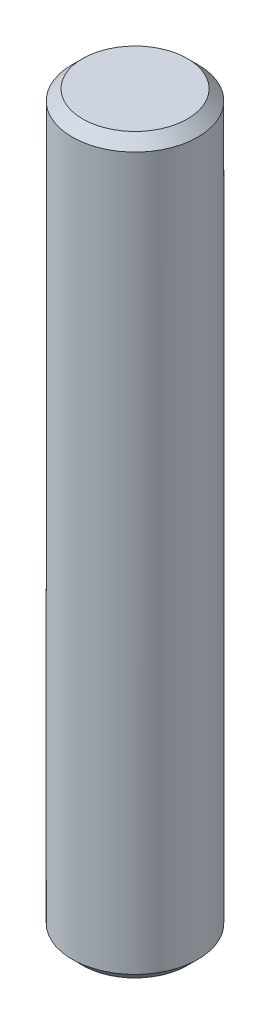
ISO-10303-21;
HEADER;
FILE_DESCRIPTION(('STEP AP214'),'2;1');
FILE_NAME('part.step','',(''),(''),'','','');
FILE_SCHEMA(('AUTOMOTIVE_DESIGN { 1 0 10303 214 1 1 1 1 }'));
ENDSEC;
DATA;
#1=APPLICATION_CONTEXT('core data for automotive mechanical design processes');
#2=APPLICATION_PROTOCOL_DEFINITION('international standard','automotive_design',2000,#1);
#3=PRODUCT_CONTEXT('',#1,'mechanical');
#4=PRODUCT('Part','Part','',(#3));
#5=PRODUCT_RELATED_PRODUCT_CATEGORY('part','',(#4));
#6=PRODUCT_DEFINITION_FORMATION('','',#4);
#7=PRODUCT_DEFINITION_CONTEXT('part definition',#1,'design');
#8=PRODUCT_DEFINITION('design','',#6,#7);
#9=PRODUCT_DEFINITION_SHAPE('','',#8);
#10=(LENGTH_UNIT() NAMED_UNIT(*) SI_UNIT(.MILLI.,.METRE.));
#11=(NAMED_UNIT(*) PLANE_ANGLE_UNIT() SI_UNIT($,.RADIAN.));
#12=(NAMED_UNIT(*) SI_UNIT($,.STERADIAN.) SOLID_ANGLE_UNIT());
#13=UNCERTAINTY_MEASURE_WITH_UNIT(LENGTH_MEASURE(1.E-05),#10,'distance_accuracy_value','');
#14=(GEOMETRIC_REPRESENTATION_CONTEXT(3) GLOBAL_UNCERTAINTY_ASSIGNED_CONTEXT((#13)) GLOBAL_UNIT_ASSIGNED_CONTEXT((#10,
#11,#12)) REPRESENTATION_CONTEXT('',''));
#15=CARTESIAN_POINT('',(0.,0.,0.));
#16=DIRECTION('',(0.,0.,1.));
#17=DIRECTION('',(1.,0.,0.));
#18=AXIS2_PLACEMENT_3D('',#15,#16,#17);
#19=CARTESIAN_POINT('',(0.,70.,0.));
#20=DIRECTION('',(0.,1.,0.));
#21=DIRECTION('',(0.,0.,1.));
#22=AXIS2_PLACEMENT_3D('',#19,#20,#21);
#23=PLANE('',#22);
#24=CARTESIAN_POINT('',(0.,70.,0.));
#25=DIRECTION('',(0.,1.,0.));
#26=DIRECTION('',(0.,0.,1.));
#27=AXIS2_PLACEMENT_3D('',#24,#25,#26);
#28=CIRCLE('',#27,4.99999999999999);
#29=CARTESIAN_POINT('',(0.,70.,4.99999999999999));
#30=VERTEX_POINT('',#29);
#31=EDGE_CURVE('E10',#30,#30,#28,.T.);
#32=ORIENTED_EDGE('',*,*,#31,.T.);
#33=EDGE_LOOP('',(#32));
#34=FACE_BOUND('',#33,.T.);
#35=ADVANCED_FACE('F39',(#34),#23,.T.);
#36=CARTESIAN_POINT('',(0.,0.,0.));
#37=DIRECTION('',(0.,-1.,0.));
#38=DIRECTION('',(0.,0.,-1.));
#39=AXIS2_PLACEMENT_3D('',#36,#37,#38);
#40=CYLINDRICAL_SURFACE('',#39,6.);
#41=CARTESIAN_POINT('',(0.,1.00000000000001,0.));
#42=DIRECTION('',(0.,-1.,0.));
#43=DIRECTION('',(0.,0.,-1.));
#44=AXIS2_PLACEMENT_3D('',#41,#42,#43);
#45=CIRCLE('',#44,6.);
#46=CARTESIAN_POINT('',(0.,1.00000000000001,-6.));
#47=VERTEX_POINT('',#46);
#48=EDGE_CURVE('E47',#47,#47,#45,.F.);
#49=ORIENTED_EDGE('',*,*,#48,.T.);
#50=EDGE_LOOP('',(#49));
#51=FACE_BOUND('',#50,.T.);
#52=CARTESIAN_POINT('',(0.,69.,0.));
#53=DIRECTION('',(0.,1.,0.));
#54=DIRECTION('',(0.,0.,1.));
#55=AXIS2_PLACEMENT_3D('',#52,#53,#54);
#56=CIRCLE('',#55,6.);
#57=CARTESIAN_POINT('',(0.,69.,6.));
#58=VERTEX_POINT('',#57);
#59=EDGE_CURVE('E51',#58,#58,#56,.F.);
#60=ORIENTED_EDGE('',*,*,#59,.T.);
#61=EDGE_LOOP('',(#60));
#62=FACE_BOUND('',#61,.T.);
#63=ADVANCED_FACE('F71',(#51,#62),#40,.T.);
#64=CARTESIAN_POINT('',(0.,0.,0.));
#65=DIRECTION('',(0.,-1.,0.));
#66=DIRECTION('',(0.,0.,-1.));
#67=AXIS2_PLACEMENT_3D('',#64,#65,#66);
#68=PLANE('',#67);
#69=CARTESIAN_POINT('',(0.,0.,0.));
#70=DIRECTION('',(0.,-1.,0.));
#71=DIRECTION('',(0.,0.,-1.));
#72=AXIS2_PLACEMENT_3D('',#69,#70,#71);
#73=CIRCLE('',#72,4.99999999999999);
#74=CARTESIAN_POINT('',(0.,0.,-4.99999999999999));
#75=VERTEX_POINT('',#74);
#76=EDGE_CURVE('E55',#75,#75,#73,.T.);
#77=ORIENTED_EDGE('',*,*,#76,.T.);
#78=EDGE_LOOP('',(#77));
#79=FACE_BOUND('',#78,.T.);
#80=ADVANCED_FACE('F61',(#79),#68,.T.);
#81=CARTESIAN_POINT('',(0.,0.,0.));
#82=DIRECTION('',(0.,1.,0.));
#83=DIRECTION('',(0.,0.,1.));
#84=AXIS2_PLACEMENT_3D('',#81,#82,#83);
#85=CONICAL_SURFACE('',#84,4.99999999999999,0.785398163397448);
#86=ORIENTED_EDGE('',*,*,#48,.F.);
#87=EDGE_LOOP('',(#86));
#88=FACE_BOUND('',#87,.T.);
#89=ORIENTED_EDGE('',*,*,#76,.F.);
#90=EDGE_LOOP('',(#89));
#91=FACE_BOUND('',#90,.T.);
#92=ADVANCED_FACE('F63',(#88,#91),#85,.T.);
#93=CARTESIAN_POINT('',(0.,69.,0.));
#94=DIRECTION('',(0.,-1.,0.));
#95=DIRECTION('',(0.,0.,-1.));
#96=AXIS2_PLACEMENT_3D('',#93,#94,#95);
#97=CONICAL_SURFACE('',#96,6.,0.785398163397446);
#98=ORIENTED_EDGE('',*,*,#31,.F.);
#99=EDGE_LOOP('',(#98));
#100=FACE_BOUND('',#99,.T.);
#101=ORIENTED_EDGE('',*,*,#59,.F.);
#102=EDGE_LOOP('',(#101));
#103=FACE_BOUND('',#102,.T.);
#104=ADVANCED_FACE('F42',(#100,#103),#97,.T.);
#105=CLOSED_SHELL('',(#35,#63,#80,#92,#104));
#106=MANIFOLD_SOLID_BREP('B2',#105);
#107=ADVANCED_BREP_SHAPE_REPRESENTATION('',(#18,#106),#14);
#108=SHAPE_DEFINITION_REPRESENTATION(#9,#107);
ENDSEC;
END-ISO-10303-21;
